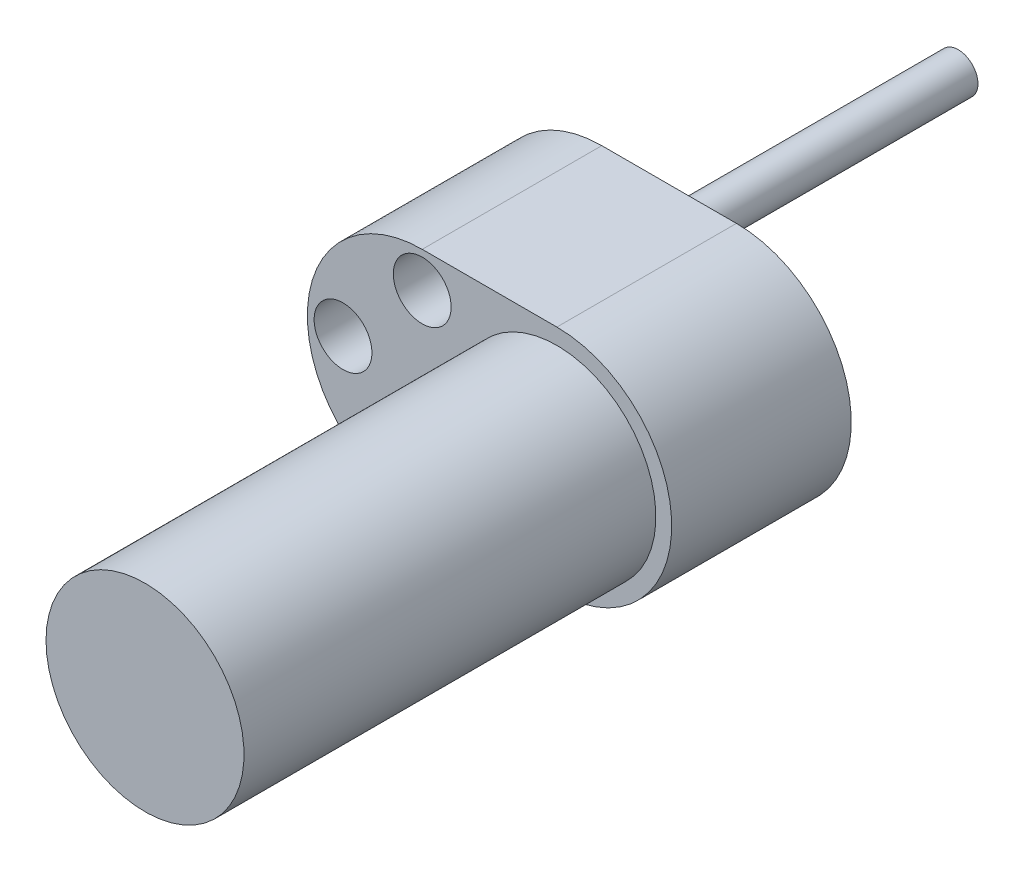
ISO-10303-21;
HEADER;
FILE_DESCRIPTION(('STEP AP214'),'2;1');
FILE_NAME('part.step','',(''),(''),'','','');
FILE_SCHEMA(('AUTOMOTIVE_DESIGN { 1 0 10303 214 1 1 1 1 }'));
ENDSEC;
DATA;
#1=APPLICATION_CONTEXT('core data for automotive mechanical design processes');
#2=APPLICATION_PROTOCOL_DEFINITION('international standard','automotive_design',2000,#1);
#3=PRODUCT_CONTEXT('',#1,'mechanical');
#4=PRODUCT('Part','Part','',(#3));
#5=PRODUCT_RELATED_PRODUCT_CATEGORY('part','',(#4));
#6=PRODUCT_DEFINITION_FORMATION('','',#4);
#7=PRODUCT_DEFINITION_CONTEXT('part definition',#1,'design');
#8=PRODUCT_DEFINITION('design','',#6,#7);
#9=PRODUCT_DEFINITION_SHAPE('','',#8);
#10=(LENGTH_UNIT() NAMED_UNIT(*) SI_UNIT(.MILLI.,.METRE.));
#11=(NAMED_UNIT(*) PLANE_ANGLE_UNIT() SI_UNIT($,.RADIAN.));
#12=(NAMED_UNIT(*) SI_UNIT($,.STERADIAN.) SOLID_ANGLE_UNIT());
#13=UNCERTAINTY_MEASURE_WITH_UNIT(LENGTH_MEASURE(1.E-05),#10,'distance_accuracy_value','');
#14=(GEOMETRIC_REPRESENTATION_CONTEXT(3) GLOBAL_UNCERTAINTY_ASSIGNED_CONTEXT((#13)) GLOBAL_UNIT_ASSIGNED_CONTEXT((#10,
#11,#12)) REPRESENTATION_CONTEXT('',''));
#15=CARTESIAN_POINT('',(0.,0.,0.));
#16=DIRECTION('',(0.,0.,1.));
#17=DIRECTION('',(1.,0.,0.));
#18=AXIS2_PLACEMENT_3D('',#15,#16,#17);
#19=CARTESIAN_POINT('',(-31.5,21.,22.67));
#20=DIRECTION('',(0.,0.,-1.));
#21=DIRECTION('',(-1.,0.,0.));
#22=AXIS2_PLACEMENT_3D('',#19,#20,#21);
#23=CYLINDRICAL_SURFACE('',#22,14.5);
#24=CARTESIAN_POINT('',(-31.5,21.,0.));
#25=DIRECTION('',(0.,0.,1.));
#26=DIRECTION('',(1.,0.,0.));
#27=AXIS2_PLACEMENT_3D('',#24,#25,#26);
#28=CIRCLE('',#27,14.5);
#29=CARTESIAN_POINT('',(-31.5,35.5,0.));
#30=VERTEX_POINT('',#29);
#31=CARTESIAN_POINT('',(-31.5,6.5,0.));
#32=VERTEX_POINT('',#31);
#33=EDGE_CURVE('E109',#30,#32,#28,.T.);
#34=ORIENTED_EDGE('',*,*,#33,.T.);
#35=DIRECTION('',(0.,0.,-1.));
#36=VECTOR('',#35,1.);
#37=CARTESIAN_POINT('',(-31.5,6.5,22.67));
#38=LINE('',#37,#36);
#39=CARTESIAN_POINT('',(-31.5,6.5,22.67));
#40=VERTEX_POINT('',#39);
#41=EDGE_CURVE('E51',#40,#32,#38,.T.);
#42=ORIENTED_EDGE('',*,*,#41,.F.);
#43=CARTESIAN_POINT('',(-31.5,21.,22.67));
#44=DIRECTION('',(0.,0.,1.));
#45=DIRECTION('',(1.,0.,0.));
#46=AXIS2_PLACEMENT_3D('',#43,#44,#45);
#47=CIRCLE('',#46,14.5);
#48=CARTESIAN_POINT('',(-31.5,35.5,22.67));
#49=VERTEX_POINT('',#48);
#50=EDGE_CURVE('E95',#49,#40,#47,.T.);
#51=ORIENTED_EDGE('',*,*,#50,.F.);
#52=DIRECTION('',(0.,0.,-1.));
#53=VECTOR('',#52,1.);
#54=CARTESIAN_POINT('',(-31.5,35.5,22.67));
#55=LINE('',#54,#53);
#56=EDGE_CURVE('E105',#49,#30,#55,.T.);
#57=ORIENTED_EDGE('',*,*,#56,.T.);
#58=EDGE_LOOP('',(#34,#42,#51,#57));
#59=FACE_BOUND('',#58,.T.);
#60=ADVANCED_FACE('F43',(#59),#23,.T.);
#61=CARTESIAN_POINT('',(-31.5,6.5,22.67));
#62=DIRECTION('',(0.,1.,0.));
#63=DIRECTION('',(0.,0.,1.));
#64=AXIS2_PLACEMENT_3D('',#61,#62,#63);
#65=PLANE('',#64);
#66=DIRECTION('',(1.,0.,0.));
#67=VECTOR('',#66,1.);
#68=CARTESIAN_POINT('',(-31.5,6.5,0.));
#69=LINE('',#68,#67);
#70=CARTESIAN_POINT('',(-14.5,6.5,0.));
#71=VERTEX_POINT('',#70);
#72=EDGE_CURVE('E100',#32,#71,#69,.T.);
#73=ORIENTED_EDGE('',*,*,#72,.T.);
#74=DIRECTION('',(0.,0.,-1.));
#75=VECTOR('',#74,1.);
#76=CARTESIAN_POINT('',(-14.5,6.5,22.67));
#77=LINE('',#76,#75);
#78=CARTESIAN_POINT('',(-14.5,6.5,22.67));
#79=VERTEX_POINT('',#78);
#80=EDGE_CURVE('E98',#79,#71,#77,.T.);
#81=ORIENTED_EDGE('',*,*,#80,.F.);
#82=DIRECTION('',(1.,0.,0.));
#83=VECTOR('',#82,1.);
#84=CARTESIAN_POINT('',(-31.5,6.5,22.67));
#85=LINE('',#84,#83);
#86=EDGE_CURVE('E90',#40,#79,#85,.T.);
#87=ORIENTED_EDGE('',*,*,#86,.F.);
#88=ORIENTED_EDGE('',*,*,#41,.T.);
#89=EDGE_LOOP('',(#73,#81,#87,#88));
#90=FACE_BOUND('',#89,.T.);
#91=ADVANCED_FACE('F99',(#90),#65,.F.);
#92=CARTESIAN_POINT('',(-14.5,21.,22.67));
#93=DIRECTION('',(0.,0.,-1.));
#94=DIRECTION('',(-1.,0.,0.));
#95=AXIS2_PLACEMENT_3D('',#92,#93,#94);
#96=CYLINDRICAL_SURFACE('',#95,14.5);
#97=CARTESIAN_POINT('',(-14.5,21.,0.));
#98=DIRECTION('',(0.,0.,1.));
#99=DIRECTION('',(1.,0.,0.));
#100=AXIS2_PLACEMENT_3D('',#97,#98,#99);
#101=CIRCLE('',#100,14.5);
#102=CARTESIAN_POINT('',(-14.5,35.5,0.));
#103=VERTEX_POINT('',#102);
#104=EDGE_CURVE('E76',#71,#103,#101,.T.);
#105=ORIENTED_EDGE('',*,*,#104,.T.);
#106=DIRECTION('',(0.,0.,-1.));
#107=VECTOR('',#106,1.);
#108=CARTESIAN_POINT('',(-14.5,35.5,22.67));
#109=LINE('',#108,#107);
#110=CARTESIAN_POINT('',(-14.5,35.5,22.67));
#111=VERTEX_POINT('',#110);
#112=EDGE_CURVE('E101',#111,#103,#109,.T.);
#113=ORIENTED_EDGE('',*,*,#112,.F.);
#114=CARTESIAN_POINT('',(-14.5,21.,22.67));
#115=DIRECTION('',(0.,0.,1.));
#116=DIRECTION('',(1.,0.,0.));
#117=AXIS2_PLACEMENT_3D('',#114,#115,#116);
#118=CIRCLE('',#117,14.5);
#119=EDGE_CURVE('E93',#79,#111,#118,.T.);
#120=ORIENTED_EDGE('',*,*,#119,.F.);
#121=ORIENTED_EDGE('',*,*,#80,.T.);
#122=EDGE_LOOP('',(#105,#113,#120,#121));
#123=FACE_BOUND('',#122,.T.);
#124=ADVANCED_FACE('F103',(#123),#96,.T.);
#125=CARTESIAN_POINT('',(-31.5,35.5,22.67));
#126=DIRECTION('',(0.,-1.,0.));
#127=DIRECTION('',(1.,0.,0.));
#128=AXIS2_PLACEMENT_3D('',#125,#126,#127);
#129=PLANE('',#128);
#130=DIRECTION('',(-1.,0.,0.));
#131=VECTOR('',#130,1.);
#132=CARTESIAN_POINT('',(-31.5,35.5,0.));
#133=LINE('',#132,#131);
#134=EDGE_CURVE('E82',#103,#30,#133,.T.);
#135=ORIENTED_EDGE('',*,*,#134,.T.);
#136=ORIENTED_EDGE('',*,*,#56,.F.);
#137=DIRECTION('',(-1.,0.,0.));
#138=VECTOR('',#137,1.);
#139=CARTESIAN_POINT('',(-31.5,35.5,22.67));
#140=LINE('',#139,#138);
#141=EDGE_CURVE('E59',#111,#49,#140,.T.);
#142=ORIENTED_EDGE('',*,*,#141,.F.);
#143=ORIENTED_EDGE('',*,*,#112,.T.);
#144=EDGE_LOOP('',(#135,#136,#142,#143));
#145=FACE_BOUND('',#144,.T.);
#146=ADVANCED_FACE('F133',(#145),#129,.F.);
#147=CARTESIAN_POINT('',(-31.5,21.,22.67));
#148=DIRECTION('',(0.,0.,1.));
#149=DIRECTION('',(1.,0.,0.));
#150=AXIS2_PLACEMENT_3D('',#147,#148,#149);
#151=PLANE('',#150);
#152=CARTESIAN_POINT('',(-14.5,21.,22.67));
#153=DIRECTION('',(0.,0.,1.));
#154=DIRECTION('',(1.,0.,0.));
#155=AXIS2_PLACEMENT_3D('',#152,#153,#154);
#156=CIRCLE('',#155,12.5);
#157=CARTESIAN_POINT('',(-27.,21.,22.67));
#158=VERTEX_POINT('',#157);
#159=EDGE_CURVE('E296',#158,#158,#156,.T.);
#160=ORIENTED_EDGE('',*,*,#159,.F.);
#161=EDGE_LOOP('',(#160));
#162=FACE_BOUND('',#161,.T.);
#163=CARTESIAN_POINT('',(-31.5,11.,22.67));
#164=DIRECTION('',(0.,0.,-1.));
#165=DIRECTION('',(-1.,0.,0.));
#166=AXIS2_PLACEMENT_3D('',#163,#164,#165);
#167=CIRCLE('',#166,3.65);
#168=CARTESIAN_POINT('',(-35.15,11.,22.67));
#169=VERTEX_POINT('',#168);
#170=EDGE_CURVE('E112',#169,#169,#167,.T.);
#171=ORIENTED_EDGE('',*,*,#170,.T.);
#172=EDGE_LOOP('',(#171));
#173=FACE_BOUND('',#172,.T.);
#174=CARTESIAN_POINT('',(-31.5,31.,22.67));
#175=DIRECTION('',(0.,0.,-1.));
#176=DIRECTION('',(-1.,0.,0.));
#177=AXIS2_PLACEMENT_3D('',#174,#175,#176);
#178=CIRCLE('',#177,3.65);
#179=CARTESIAN_POINT('',(-35.15,31.,22.67));
#180=VERTEX_POINT('',#179);
#181=EDGE_CURVE('E271',#180,#180,#178,.T.);
#182=ORIENTED_EDGE('',*,*,#181,.T.);
#183=EDGE_LOOP('',(#182));
#184=FACE_BOUND('',#183,.T.);
#185=CARTESIAN_POINT('',(-41.5,21.,22.67));
#186=DIRECTION('',(0.,0.,-1.));
#187=DIRECTION('',(-1.,0.,0.));
#188=AXIS2_PLACEMENT_3D('',#185,#186,#187);
#189=CIRCLE('',#188,3.65);
#190=CARTESIAN_POINT('',(-45.15,21.,22.67));
#191=VERTEX_POINT('',#190);
#192=EDGE_CURVE('E286',#191,#191,#189,.T.);
#193=ORIENTED_EDGE('',*,*,#192,.T.);
#194=EDGE_LOOP('',(#193));
#195=FACE_BOUND('',#194,.T.);
#196=ORIENTED_EDGE('',*,*,#50,.T.);
#197=ORIENTED_EDGE('',*,*,#86,.T.);
#198=ORIENTED_EDGE('',*,*,#119,.T.);
#199=ORIENTED_EDGE('',*,*,#141,.T.);
#200=EDGE_LOOP('',(#196,#197,#198,#199));
#201=FACE_BOUND('',#200,.T.);
#202=ADVANCED_FACE('F91',(#162,#173,#184,#195,#201),#151,.T.);
#203=CARTESIAN_POINT('',(-31.5,21.,0.));
#204=DIRECTION('',(0.,0.,1.));
#205=DIRECTION('',(1.,0.,0.));
#206=AXIS2_PLACEMENT_3D('',#203,#204,#205);
#207=PLANE('',#206);
#208=CARTESIAN_POINT('',(-31.5,21.,0.));
#209=DIRECTION('',(0.,0.,1.));
#210=DIRECTION('',(1.,0.,0.));
#211=AXIS2_PLACEMENT_3D('',#208,#209,#210);
#212=CIRCLE('',#211,2.50000000000001);
#213=CARTESIAN_POINT('',(-29.,21.,0.));
#214=VERTEX_POINT('',#213);
#215=EDGE_CURVE('E11',#214,#214,#212,.F.);
#216=ORIENTED_EDGE('',*,*,#215,.F.);
#217=EDGE_LOOP('',(#216));
#218=FACE_BOUND('',#217,.T.);
#219=CARTESIAN_POINT('',(-31.5,11.,0.));
#220=DIRECTION('',(0.,0.,-1.));
#221=DIRECTION('',(-1.,0.,0.));
#222=AXIS2_PLACEMENT_3D('',#219,#220,#221);
#223=CIRCLE('',#222,3.65);
#224=CARTESIAN_POINT('',(-35.15,11.,0.));
#225=VERTEX_POINT('',#224);
#226=EDGE_CURVE('E276',#225,#225,#223,.T.);
#227=ORIENTED_EDGE('',*,*,#226,.F.);
#228=EDGE_LOOP('',(#227));
#229=FACE_BOUND('',#228,.T.);
#230=CARTESIAN_POINT('',(-31.5,31.,0.));
#231=DIRECTION('',(0.,0.,-1.));
#232=DIRECTION('',(-1.,0.,0.));
#233=AXIS2_PLACEMENT_3D('',#230,#231,#232);
#234=CIRCLE('',#233,3.65);
#235=CARTESIAN_POINT('',(-35.15,31.,0.));
#236=VERTEX_POINT('',#235);
#237=EDGE_CURVE('E274',#236,#236,#234,.T.);
#238=ORIENTED_EDGE('',*,*,#237,.F.);
#239=EDGE_LOOP('',(#238));
#240=FACE_BOUND('',#239,.T.);
#241=CARTESIAN_POINT('',(-41.5,21.,0.));
#242=DIRECTION('',(0.,0.,-1.));
#243=DIRECTION('',(-1.,0.,0.));
#244=AXIS2_PLACEMENT_3D('',#241,#242,#243);
#245=CIRCLE('',#244,3.65);
#246=CARTESIAN_POINT('',(-45.15,21.,0.));
#247=VERTEX_POINT('',#246);
#248=EDGE_CURVE('E280',#247,#247,#245,.T.);
#249=ORIENTED_EDGE('',*,*,#248,.F.);
#250=EDGE_LOOP('',(#249));
#251=FACE_BOUND('',#250,.T.);
#252=ORIENTED_EDGE('',*,*,#33,.F.);
#253=ORIENTED_EDGE('',*,*,#134,.F.);
#254=ORIENTED_EDGE('',*,*,#104,.F.);
#255=ORIENTED_EDGE('',*,*,#72,.F.);
#256=EDGE_LOOP('',(#252,#253,#254,#255));
#257=FACE_BOUND('',#256,.T.);
#258=ADVANCED_FACE('F120',(#218,#229,#240,#251,#257),#207,.F.);
#259=CARTESIAN_POINT('',(-41.5,21.,22.67));
#260=DIRECTION('',(0.,0.,-1.));
#261=DIRECTION('',(-1.,0.,0.));
#262=AXIS2_PLACEMENT_3D('',#259,#260,#261);
#263=CYLINDRICAL_SURFACE('',#262,3.65);
#264=CARTESIAN_POINT('',(-45.15,21.,22.67));
#265=CARTESIAN_POINT('',(-45.15,21.,22.4338541666667));
#266=CARTESIAN_POINT('',(-45.15,21.,22.1977083333333));
#267=CARTESIAN_POINT('',(-45.15,21.,21.7254166666667));
#268=CARTESIAN_POINT('',(-45.15,21.,21.4892708333333));
#269=CARTESIAN_POINT('',(-45.15,21.,21.0169791666667));
#270=CARTESIAN_POINT('',(-45.15,21.,20.7808333333333));
#271=CARTESIAN_POINT('',(-45.15,21.,20.3085416666667));
#272=CARTESIAN_POINT('',(-45.15,21.,20.0723958333333));
#273=CARTESIAN_POINT('',(-45.15,21.,19.6001041666667));
#274=CARTESIAN_POINT('',(-45.15,21.,19.3639583333333));
#275=CARTESIAN_POINT('',(-45.15,21.,18.8916666666667));
#276=CARTESIAN_POINT('',(-45.15,21.,18.6555208333333));
#277=CARTESIAN_POINT('',(-45.15,21.,18.1832291666667));
#278=CARTESIAN_POINT('',(-45.15,21.,17.9470833333333));
#279=CARTESIAN_POINT('',(-45.15,21.,17.4747916666667));
#280=CARTESIAN_POINT('',(-45.15,21.,17.2386458333333));
#281=CARTESIAN_POINT('',(-45.15,21.,16.7663541666667));
#282=CARTESIAN_POINT('',(-45.15,21.,16.5302083333333));
#283=CARTESIAN_POINT('',(-45.15,21.,16.0579166666667));
#284=CARTESIAN_POINT('',(-45.15,21.,15.8217708333333));
#285=CARTESIAN_POINT('',(-45.15,21.,15.3494791666667));
#286=CARTESIAN_POINT('',(-45.15,21.,15.1133333333333));
#287=CARTESIAN_POINT('',(-45.15,21.,14.6410416666667));
#288=CARTESIAN_POINT('',(-45.15,21.,14.4048958333333));
#289=CARTESIAN_POINT('',(-45.15,21.,13.9326041666667));
#290=CARTESIAN_POINT('',(-45.15,21.,13.6964583333333));
#291=CARTESIAN_POINT('',(-45.15,21.,13.2241666666667));
#292=CARTESIAN_POINT('',(-45.15,21.,12.9880208333333));
#293=CARTESIAN_POINT('',(-45.15,21.,12.5157291666667));
#294=CARTESIAN_POINT('',(-45.15,21.,12.2795833333333));
#295=CARTESIAN_POINT('',(-45.15,21.,11.8072916666667));
#296=CARTESIAN_POINT('',(-45.15,21.,11.5711458333333));
#297=CARTESIAN_POINT('',(-45.15,21.,11.0988541666667));
#298=CARTESIAN_POINT('',(-45.15,21.,10.8627083333333));
#299=CARTESIAN_POINT('',(-45.15,21.,10.3904166666667));
#300=CARTESIAN_POINT('',(-45.15,21.,10.1542708333333));
#301=CARTESIAN_POINT('',(-45.15,21.,9.68197916666667));
#302=CARTESIAN_POINT('',(-45.15,21.,9.44583333333334));
#303=CARTESIAN_POINT('',(-45.15,21.,8.97354166666667));
#304=CARTESIAN_POINT('',(-45.15,21.,8.73739583333334));
#305=CARTESIAN_POINT('',(-45.15,21.,8.26510416666667));
#306=CARTESIAN_POINT('',(-45.15,21.,8.02895833333334));
#307=CARTESIAN_POINT('',(-45.15,21.,7.55666666666667));
#308=CARTESIAN_POINT('',(-45.15,21.,7.32052083333334));
#309=CARTESIAN_POINT('',(-45.15,21.,6.84822916666667));
#310=CARTESIAN_POINT('',(-45.15,21.,6.61208333333334));
#311=CARTESIAN_POINT('',(-45.15,21.,6.13979166666667));
#312=CARTESIAN_POINT('',(-45.15,21.,5.90364583333334));
#313=CARTESIAN_POINT('',(-45.15,21.,5.43135416666667));
#314=CARTESIAN_POINT('',(-45.15,21.,5.19520833333334));
#315=CARTESIAN_POINT('',(-45.15,21.,4.72291666666667));
#316=CARTESIAN_POINT('',(-45.15,21.,4.48677083333334));
#317=CARTESIAN_POINT('',(-45.15,21.,4.01447916666667));
#318=CARTESIAN_POINT('',(-45.15,21.,3.77833333333334));
#319=CARTESIAN_POINT('',(-45.15,21.,3.30604166666667));
#320=CARTESIAN_POINT('',(-45.15,21.,3.06989583333334));
#321=CARTESIAN_POINT('',(-45.15,21.,2.59760416666667));
#322=CARTESIAN_POINT('',(-45.15,21.,2.36145833333334));
#323=CARTESIAN_POINT('',(-45.15,21.,1.88916666666667));
#324=CARTESIAN_POINT('',(-45.15,21.,1.65302083333334));
#325=CARTESIAN_POINT('',(-45.15,21.,1.18072916666667));
#326=CARTESIAN_POINT('',(-45.15,21.,0.944583333333337));
#327=CARTESIAN_POINT('',(-45.15,21.,0.472291666666669));
#328=CARTESIAN_POINT('',(-45.15,21.,0.236145833333337));
#329=CARTESIAN_POINT('',(-45.15,21.,0.));
#330=B_SPLINE_CURVE_WITH_KNOTS('',3,(#264,#265,#266,#267,#268,#269,#270,#271,#272,#273,#274,
#275,#276,#277,#278,#279,#280,#281,#282,#283,#284,#285,#286,#287,#288,#289,#290,#291,#292,#293,
#294,#295,#296,#297,#298,#299,#300,#301,#302,#303,#304,#305,#306,#307,#308,#309,#310,#311,#312,
#313,#314,#315,#316,#317,#318,#319,#320,#321,#322,#323,#324,#325,#326,#327,#328,#329),
.UNSPECIFIED.,.F.,.F.,(4,2,2,2,2,2,2,2,2,2,2,2,2,2,2,2,2,2,2,2,2,2,2,2,2,2,2,2,2,2,2,2,4),(0.,
0.708437499999999,1.416875,2.1253125,2.83375,3.5421875,4.250625,4.9590625,5.6675,6.3759375,
7.084375,7.7928125,8.50125,9.2096875,9.918125,10.6265625,11.335,12.0434375,12.751875,13.4603125,
14.16875,14.8771875,15.585625,16.2940625,17.0025,17.7109375,18.419375,19.1278125,19.83625,
20.5446875,21.253125,21.9615625,22.67),.UNSPECIFIED.);
#331=EDGE_CURVE('BSEAM122',#191,#247,#330,.T.);
#332=ORIENTED_EDGE('',*,*,#192,.F.);
#333=ORIENTED_EDGE('',*,*,#248,.T.);
#334=ORIENTED_EDGE('',*,*,#331,.T.);
#335=ORIENTED_EDGE('',*,*,#331,.F.);
#336=EDGE_LOOP('',(#332,#334,#333,#335));
#337=FACE_BOUND('',#336,.T.);
#338=ADVANCED_FACE('F122',(#337),#263,.F.);
#339=CARTESIAN_POINT('',(-31.5,31.,22.67));
#340=DIRECTION('',(0.,0.,-1.));
#341=DIRECTION('',(-1.,0.,0.));
#342=AXIS2_PLACEMENT_3D('',#339,#340,#341);
#343=CYLINDRICAL_SURFACE('',#342,3.65);
#344=CARTESIAN_POINT('',(-35.15,31.,22.67));
#345=CARTESIAN_POINT('',(-35.15,31.,22.4338541666667));
#346=CARTESIAN_POINT('',(-35.15,31.,22.1977083333333));
#347=CARTESIAN_POINT('',(-35.15,31.,21.7254166666667));
#348=CARTESIAN_POINT('',(-35.15,31.,21.4892708333333));
#349=CARTESIAN_POINT('',(-35.15,31.,21.0169791666667));
#350=CARTESIAN_POINT('',(-35.15,31.,20.7808333333333));
#351=CARTESIAN_POINT('',(-35.15,31.,20.3085416666667));
#352=CARTESIAN_POINT('',(-35.15,31.,20.0723958333333));
#353=CARTESIAN_POINT('',(-35.15,31.,19.6001041666667));
#354=CARTESIAN_POINT('',(-35.15,31.,19.3639583333333));
#355=CARTESIAN_POINT('',(-35.15,31.,18.8916666666667));
#356=CARTESIAN_POINT('',(-35.15,31.,18.6555208333333));
#357=CARTESIAN_POINT('',(-35.15,31.,18.1832291666667));
#358=CARTESIAN_POINT('',(-35.15,31.,17.9470833333333));
#359=CARTESIAN_POINT('',(-35.15,31.,17.4747916666667));
#360=CARTESIAN_POINT('',(-35.15,31.,17.2386458333333));
#361=CARTESIAN_POINT('',(-35.15,31.,16.7663541666667));
#362=CARTESIAN_POINT('',(-35.15,31.,16.5302083333333));
#363=CARTESIAN_POINT('',(-35.15,31.,16.0579166666667));
#364=CARTESIAN_POINT('',(-35.15,31.,15.8217708333333));
#365=CARTESIAN_POINT('',(-35.15,31.,15.3494791666667));
#366=CARTESIAN_POINT('',(-35.15,31.,15.1133333333333));
#367=CARTESIAN_POINT('',(-35.15,31.,14.6410416666667));
#368=CARTESIAN_POINT('',(-35.15,31.,14.4048958333333));
#369=CARTESIAN_POINT('',(-35.15,31.,13.9326041666667));
#370=CARTESIAN_POINT('',(-35.15,31.,13.6964583333333));
#371=CARTESIAN_POINT('',(-35.15,31.,13.2241666666667));
#372=CARTESIAN_POINT('',(-35.15,31.,12.9880208333333));
#373=CARTESIAN_POINT('',(-35.15,31.,12.5157291666667));
#374=CARTESIAN_POINT('',(-35.15,31.,12.2795833333333));
#375=CARTESIAN_POINT('',(-35.15,31.,11.8072916666667));
#376=CARTESIAN_POINT('',(-35.15,31.,11.5711458333333));
#377=CARTESIAN_POINT('',(-35.15,31.,11.0988541666667));
#378=CARTESIAN_POINT('',(-35.15,31.,10.8627083333333));
#379=CARTESIAN_POINT('',(-35.15,31.,10.3904166666667));
#380=CARTESIAN_POINT('',(-35.15,31.,10.1542708333333));
#381=CARTESIAN_POINT('',(-35.15,31.,9.68197916666667));
#382=CARTESIAN_POINT('',(-35.15,31.,9.44583333333334));
#383=CARTESIAN_POINT('',(-35.15,31.,8.97354166666667));
#384=CARTESIAN_POINT('',(-35.15,31.,8.73739583333334));
#385=CARTESIAN_POINT('',(-35.15,31.,8.26510416666667));
#386=CARTESIAN_POINT('',(-35.15,31.,8.02895833333334));
#387=CARTESIAN_POINT('',(-35.15,31.,7.55666666666667));
#388=CARTESIAN_POINT('',(-35.15,31.,7.32052083333334));
#389=CARTESIAN_POINT('',(-35.15,31.,6.84822916666667));
#390=CARTESIAN_POINT('',(-35.15,31.,6.61208333333334));
#391=CARTESIAN_POINT('',(-35.15,31.,6.13979166666667));
#392=CARTESIAN_POINT('',(-35.15,31.,5.90364583333334));
#393=CARTESIAN_POINT('',(-35.15,31.,5.43135416666667));
#394=CARTESIAN_POINT('',(-35.15,31.,5.19520833333334));
#395=CARTESIAN_POINT('',(-35.15,31.,4.72291666666667));
#396=CARTESIAN_POINT('',(-35.15,31.,4.48677083333334));
#397=CARTESIAN_POINT('',(-35.15,31.,4.01447916666667));
#398=CARTESIAN_POINT('',(-35.15,31.,3.77833333333334));
#399=CARTESIAN_POINT('',(-35.15,31.,3.30604166666667));
#400=CARTESIAN_POINT('',(-35.15,31.,3.06989583333334));
#401=CARTESIAN_POINT('',(-35.15,31.,2.59760416666667));
#402=CARTESIAN_POINT('',(-35.15,31.,2.36145833333334));
#403=CARTESIAN_POINT('',(-35.15,31.,1.88916666666667));
#404=CARTESIAN_POINT('',(-35.15,31.,1.65302083333334));
#405=CARTESIAN_POINT('',(-35.15,31.,1.18072916666667));
#406=CARTESIAN_POINT('',(-35.15,31.,0.944583333333337));
#407=CARTESIAN_POINT('',(-35.15,31.,0.472291666666669));
#408=CARTESIAN_POINT('',(-35.15,31.,0.236145833333337));
#409=CARTESIAN_POINT('',(-35.15,31.,0.));
#410=B_SPLINE_CURVE_WITH_KNOTS('',3,(#344,#345,#346,#347,#348,#349,#350,#351,#352,#353,#354,
#355,#356,#357,#358,#359,#360,#361,#362,#363,#364,#365,#366,#367,#368,#369,#370,#371,#372,#373,
#374,#375,#376,#377,#378,#379,#380,#381,#382,#383,#384,#385,#386,#387,#388,#389,#390,#391,#392,
#393,#394,#395,#396,#397,#398,#399,#400,#401,#402,#403,#404,#405,#406,#407,#408,#409),
.UNSPECIFIED.,.F.,.F.,(4,2,2,2,2,2,2,2,2,2,2,2,2,2,2,2,2,2,2,2,2,2,2,2,2,2,2,2,2,2,2,2,4),(0.,
0.708437499999999,1.416875,2.1253125,2.83375,3.5421875,4.250625,4.9590625,5.6675,6.3759375,
7.084375,7.7928125,8.50125,9.2096875,9.918125,10.6265625,11.335,12.0434375,12.751875,13.4603125,
14.16875,14.8771875,15.585625,16.2940625,17.0025,17.7109375,18.419375,19.1278125,19.83625,
20.5446875,21.253125,21.9615625,22.67),.UNSPECIFIED.);
#411=EDGE_CURVE('BSEAM129',#180,#236,#410,.T.);
#412=ORIENTED_EDGE('',*,*,#181,.F.);
#413=ORIENTED_EDGE('',*,*,#237,.T.);
#414=ORIENTED_EDGE('',*,*,#411,.T.);
#415=ORIENTED_EDGE('',*,*,#411,.F.);
#416=EDGE_LOOP('',(#412,#414,#413,#415));
#417=FACE_BOUND('',#416,.T.);
#418=ADVANCED_FACE('F129',(#417),#343,.F.);
#419=CARTESIAN_POINT('',(-31.5,11.,22.67));
#420=DIRECTION('',(0.,0.,-1.));
#421=DIRECTION('',(-1.,0.,0.));
#422=AXIS2_PLACEMENT_3D('',#419,#420,#421);
#423=CYLINDRICAL_SURFACE('',#422,3.65);
#424=CARTESIAN_POINT('',(-35.15,11.,22.67));
#425=CARTESIAN_POINT('',(-35.15,11.,22.4338541666667));
#426=CARTESIAN_POINT('',(-35.15,11.,22.1977083333333));
#427=CARTESIAN_POINT('',(-35.15,11.,21.7254166666667));
#428=CARTESIAN_POINT('',(-35.15,11.,21.4892708333333));
#429=CARTESIAN_POINT('',(-35.15,11.,21.0169791666667));
#430=CARTESIAN_POINT('',(-35.15,11.,20.7808333333333));
#431=CARTESIAN_POINT('',(-35.15,11.,20.3085416666667));
#432=CARTESIAN_POINT('',(-35.15,11.,20.0723958333333));
#433=CARTESIAN_POINT('',(-35.15,11.,19.6001041666667));
#434=CARTESIAN_POINT('',(-35.15,11.,19.3639583333333));
#435=CARTESIAN_POINT('',(-35.15,11.,18.8916666666667));
#436=CARTESIAN_POINT('',(-35.15,11.,18.6555208333333));
#437=CARTESIAN_POINT('',(-35.15,11.,18.1832291666667));
#438=CARTESIAN_POINT('',(-35.15,11.,17.9470833333333));
#439=CARTESIAN_POINT('',(-35.15,11.,17.4747916666667));
#440=CARTESIAN_POINT('',(-35.15,11.,17.2386458333333));
#441=CARTESIAN_POINT('',(-35.15,11.,16.7663541666667));
#442=CARTESIAN_POINT('',(-35.15,11.,16.5302083333333));
#443=CARTESIAN_POINT('',(-35.15,11.,16.0579166666667));
#444=CARTESIAN_POINT('',(-35.15,11.,15.8217708333333));
#445=CARTESIAN_POINT('',(-35.15,11.,15.3494791666667));
#446=CARTESIAN_POINT('',(-35.15,11.,15.1133333333333));
#447=CARTESIAN_POINT('',(-35.15,11.,14.6410416666667));
#448=CARTESIAN_POINT('',(-35.15,11.,14.4048958333333));
#449=CARTESIAN_POINT('',(-35.15,11.,13.9326041666667));
#450=CARTESIAN_POINT('',(-35.15,11.,13.6964583333333));
#451=CARTESIAN_POINT('',(-35.15,11.,13.2241666666667));
#452=CARTESIAN_POINT('',(-35.15,11.,12.9880208333333));
#453=CARTESIAN_POINT('',(-35.15,11.,12.5157291666667));
#454=CARTESIAN_POINT('',(-35.15,11.,12.2795833333333));
#455=CARTESIAN_POINT('',(-35.15,11.,11.8072916666667));
#456=CARTESIAN_POINT('',(-35.15,11.,11.5711458333333));
#457=CARTESIAN_POINT('',(-35.15,11.,11.0988541666667));
#458=CARTESIAN_POINT('',(-35.15,11.,10.8627083333333));
#459=CARTESIAN_POINT('',(-35.15,11.,10.3904166666667));
#460=CARTESIAN_POINT('',(-35.15,11.,10.1542708333333));
#461=CARTESIAN_POINT('',(-35.15,11.,9.68197916666667));
#462=CARTESIAN_POINT('',(-35.15,11.,9.44583333333334));
#463=CARTESIAN_POINT('',(-35.15,11.,8.97354166666667));
#464=CARTESIAN_POINT('',(-35.15,11.,8.73739583333334));
#465=CARTESIAN_POINT('',(-35.15,11.,8.26510416666667));
#466=CARTESIAN_POINT('',(-35.15,11.,8.02895833333334));
#467=CARTESIAN_POINT('',(-35.15,11.,7.55666666666667));
#468=CARTESIAN_POINT('',(-35.15,11.,7.32052083333334));
#469=CARTESIAN_POINT('',(-35.15,11.,6.84822916666667));
#470=CARTESIAN_POINT('',(-35.15,11.,6.61208333333334));
#471=CARTESIAN_POINT('',(-35.15,11.,6.13979166666667));
#472=CARTESIAN_POINT('',(-35.15,11.,5.90364583333334));
#473=CARTESIAN_POINT('',(-35.15,11.,5.43135416666667));
#474=CARTESIAN_POINT('',(-35.15,11.,5.19520833333334));
#475=CARTESIAN_POINT('',(-35.15,11.,4.72291666666667));
#476=CARTESIAN_POINT('',(-35.15,11.,4.48677083333334));
#477=CARTESIAN_POINT('',(-35.15,11.,4.01447916666667));
#478=CARTESIAN_POINT('',(-35.15,11.,3.77833333333334));
#479=CARTESIAN_POINT('',(-35.15,11.,3.30604166666667));
#480=CARTESIAN_POINT('',(-35.15,11.,3.06989583333334));
#481=CARTESIAN_POINT('',(-35.15,11.,2.59760416666667));
#482=CARTESIAN_POINT('',(-35.15,11.,2.36145833333334));
#483=CARTESIAN_POINT('',(-35.15,11.,1.88916666666667));
#484=CARTESIAN_POINT('',(-35.15,11.,1.65302083333334));
#485=CARTESIAN_POINT('',(-35.15,11.,1.18072916666667));
#486=CARTESIAN_POINT('',(-35.15,11.,0.944583333333337));
#487=CARTESIAN_POINT('',(-35.15,11.,0.472291666666669));
#488=CARTESIAN_POINT('',(-35.15,11.,0.236145833333337));
#489=CARTESIAN_POINT('',(-35.15,11.,0.));
#490=B_SPLINE_CURVE_WITH_KNOTS('',3,(#424,#425,#426,#427,#428,#429,#430,#431,#432,#433,#434,
#435,#436,#437,#438,#439,#440,#441,#442,#443,#444,#445,#446,#447,#448,#449,#450,#451,#452,#453,
#454,#455,#456,#457,#458,#459,#460,#461,#462,#463,#464,#465,#466,#467,#468,#469,#470,#471,#472,
#473,#474,#475,#476,#477,#478,#479,#480,#481,#482,#483,#484,#485,#486,#487,#488,#489),
.UNSPECIFIED.,.F.,.F.,(4,2,2,2,2,2,2,2,2,2,2,2,2,2,2,2,2,2,2,2,2,2,2,2,2,2,2,2,2,2,2,2,4),(0.,
0.708437499999999,1.416875,2.1253125,2.83375,3.5421875,4.250625,4.9590625,5.6675,6.3759375,
7.084375,7.7928125,8.50125,9.2096875,9.918125,10.6265625,11.335,12.0434375,12.751875,13.4603125,
14.16875,14.8771875,15.585625,16.2940625,17.0025,17.7109375,18.419375,19.1278125,19.83625,
20.5446875,21.253125,21.9615625,22.67),.UNSPECIFIED.);
#491=EDGE_CURVE('BSEAM204',#169,#225,#490,.T.);
#492=ORIENTED_EDGE('',*,*,#170,.F.);
#493=ORIENTED_EDGE('',*,*,#226,.T.);
#494=ORIENTED_EDGE('',*,*,#491,.T.);
#495=ORIENTED_EDGE('',*,*,#491,.F.);
#496=EDGE_LOOP('',(#492,#494,#493,#495));
#497=FACE_BOUND('',#496,.T.);
#498=ADVANCED_FACE('F204',(#497),#423,.F.);
#499=CARTESIAN_POINT('',(-31.5,21.,-45.));
#500=DIRECTION('',(0.,0.,1.));
#501=DIRECTION('',(1.,0.,0.));
#502=AXIS2_PLACEMENT_3D('',#499,#500,#501);
#503=CYLINDRICAL_SURFACE('',#502,2.50000000000001);
#504=CARTESIAN_POINT('',(-31.5,21.,-45.));
#505=DIRECTION('',(0.,0.,-1.));
#506=DIRECTION('',(-1.,0.,0.));
#507=AXIS2_PLACEMENT_3D('',#504,#505,#506);
#508=CIRCLE('',#507,2.50000000000001);
#509=CARTESIAN_POINT('',(-29.,21.,-45.));
#510=VERTEX_POINT('',#509);
#511=EDGE_CURVE('E288',#510,#510,#508,.T.);
#512=CARTESIAN_POINT('',(-29.,21.,-45.));
#513=CARTESIAN_POINT('',(-29.,21.,-44.53125));
#514=CARTESIAN_POINT('',(-29.,21.,-44.0625));
#515=CARTESIAN_POINT('',(-29.,21.,-43.125));
#516=CARTESIAN_POINT('',(-29.,21.,-42.65625));
#517=CARTESIAN_POINT('',(-29.,21.,-41.71875));
#518=CARTESIAN_POINT('',(-29.,21.,-41.25));
#519=CARTESIAN_POINT('',(-29.,21.,-40.3125));
#520=CARTESIAN_POINT('',(-29.,21.,-39.84375));
#521=CARTESIAN_POINT('',(-29.,21.,-38.90625));
#522=CARTESIAN_POINT('',(-29.,21.,-38.4375));
#523=CARTESIAN_POINT('',(-29.,21.,-37.5));
#524=CARTESIAN_POINT('',(-29.,21.,-37.03125));
#525=CARTESIAN_POINT('',(-29.,21.,-36.09375));
#526=CARTESIAN_POINT('',(-29.,21.,-35.625));
#527=CARTESIAN_POINT('',(-29.,21.,-34.6875));
#528=CARTESIAN_POINT('',(-29.,21.,-34.21875));
#529=CARTESIAN_POINT('',(-29.,21.,-33.28125));
#530=CARTESIAN_POINT('',(-29.,21.,-32.8125));
#531=CARTESIAN_POINT('',(-29.,21.,-31.875));
#532=CARTESIAN_POINT('',(-29.,21.,-31.40625));
#533=CARTESIAN_POINT('',(-29.,21.,-30.46875));
#534=CARTESIAN_POINT('',(-29.,21.,-30.));
#535=CARTESIAN_POINT('',(-29.,21.,-29.0625));
#536=CARTESIAN_POINT('',(-29.,21.,-28.59375));
#537=CARTESIAN_POINT('',(-29.,21.,-27.65625));
#538=CARTESIAN_POINT('',(-29.,21.,-27.1875));
#539=CARTESIAN_POINT('',(-29.,21.,-26.25));
#540=CARTESIAN_POINT('',(-29.,21.,-25.78125));
#541=CARTESIAN_POINT('',(-29.,21.,-24.84375));
#542=CARTESIAN_POINT('',(-29.,21.,-24.375));
#543=CARTESIAN_POINT('',(-29.,21.,-23.4375));
#544=CARTESIAN_POINT('',(-29.,21.,-22.96875));
#545=CARTESIAN_POINT('',(-29.,21.,-22.03125));
#546=CARTESIAN_POINT('',(-29.,21.,-21.5625));
#547=CARTESIAN_POINT('',(-29.,21.,-20.625));
#548=CARTESIAN_POINT('',(-29.,21.,-20.15625));
#549=CARTESIAN_POINT('',(-29.,21.,-19.21875));
#550=CARTESIAN_POINT('',(-29.,21.,-18.75));
#551=CARTESIAN_POINT('',(-29.,21.,-17.8125));
#552=CARTESIAN_POINT('',(-29.,21.,-17.34375));
#553=CARTESIAN_POINT('',(-29.,21.,-16.40625));
#554=CARTESIAN_POINT('',(-29.,21.,-15.9375));
#555=CARTESIAN_POINT('',(-29.,21.,-15.));
#556=CARTESIAN_POINT('',(-29.,21.,-14.53125));
#557=CARTESIAN_POINT('',(-29.,21.,-13.59375));
#558=CARTESIAN_POINT('',(-29.,21.,-13.125));
#559=CARTESIAN_POINT('',(-29.,21.,-12.1875));
#560=CARTESIAN_POINT('',(-29.,21.,-11.71875));
#561=CARTESIAN_POINT('',(-29.,21.,-10.78125));
#562=CARTESIAN_POINT('',(-29.,21.,-10.3125));
#563=CARTESIAN_POINT('',(-29.,21.,-9.37500000000001));
#564=CARTESIAN_POINT('',(-29.,21.,-8.90625000000001));
#565=CARTESIAN_POINT('',(-29.,21.,-7.96875000000001));
#566=CARTESIAN_POINT('',(-29.,21.,-7.5));
#567=CARTESIAN_POINT('',(-29.,21.,-6.5625));
#568=CARTESIAN_POINT('',(-29.,21.,-6.09375));
#569=CARTESIAN_POINT('',(-29.,21.,-5.15625000000001));
#570=CARTESIAN_POINT('',(-29.,21.,-4.68750000000001));
#571=CARTESIAN_POINT('',(-29.,21.,-3.75000000000001));
#572=CARTESIAN_POINT('',(-29.,21.,-3.28125000000001));
#573=CARTESIAN_POINT('',(-29.,21.,-2.34375000000001));
#574=CARTESIAN_POINT('',(-29.,21.,-1.87500000000001));
#575=CARTESIAN_POINT('',(-29.,21.,-0.937500000000006));
#576=CARTESIAN_POINT('',(-29.,21.,-0.468750000000007));
#577=CARTESIAN_POINT('',(-29.,21.,0.));
#578=B_SPLINE_CURVE_WITH_KNOTS('',3,(#512,#513,#514,#515,#516,#517,#518,#519,#520,#521,#522,
#523,#524,#525,#526,#527,#528,#529,#530,#531,#532,#533,#534,#535,#536,#537,#538,#539,#540,#541,
#542,#543,#544,#545,#546,#547,#548,#549,#550,#551,#552,#553,#554,#555,#556,#557,#558,#559,#560,
#561,#562,#563,#564,#565,#566,#567,#568,#569,#570,#571,#572,#573,#574,#575,#576,#577),
.UNSPECIFIED.,.F.,.F.,(4,2,2,2,2,2,2,2,2,2,2,2,2,2,2,2,2,2,2,2,2,2,2,2,2,2,2,2,2,2,2,2,4),(0.,
1.40625,2.8125,4.21874999999999,5.625,7.03125,8.43749999999999,9.84374999999999,11.25,12.65625,
14.0625,15.46875,16.875,18.28125,19.6875,21.09375,22.5,23.90625,25.3125,26.71875,28.125,
29.53125,30.9375,32.34375,33.75,35.15625,36.5625,37.96875,39.375,40.78125,42.1875,43.59375,45.),.UNSPECIFIED.);
#579=EDGE_CURVE('BSEAM195',#510,#214,#578,.T.);
#580=ORIENTED_EDGE('',*,*,#511,.F.);
#581=ORIENTED_EDGE('',*,*,#215,.T.);
#582=ORIENTED_EDGE('',*,*,#579,.T.);
#583=ORIENTED_EDGE('',*,*,#579,.F.);
#584=EDGE_LOOP('',(#580,#582,#581,#583));
#585=FACE_BOUND('',#584,.T.);
#586=ADVANCED_FACE('F195',(#585),#503,.T.);
#587=CARTESIAN_POINT('',(-31.5,21.,-45.));
#588=DIRECTION('',(0.,0.,-1.));
#589=DIRECTION('',(-1.,0.,0.));
#590=AXIS2_PLACEMENT_3D('',#587,#588,#589);
#591=PLANE('',#590);
#592=ORIENTED_EDGE('',*,*,#511,.T.);
#593=EDGE_LOOP('',(#592));
#594=FACE_BOUND('',#593,.T.);
#595=ADVANCED_FACE('F164',(#594),#591,.T.);
#596=CARTESIAN_POINT('',(-14.5,21.,74.67));
#597=DIRECTION('',(0.,0.,-1.));
#598=DIRECTION('',(-1.,0.,0.));
#599=AXIS2_PLACEMENT_3D('',#596,#597,#598);
#600=CYLINDRICAL_SURFACE('',#599,12.5);
#601=CARTESIAN_POINT('',(-14.5,21.,74.67));
#602=DIRECTION('',(0.,0.,1.));
#603=DIRECTION('',(1.,0.,0.));
#604=AXIS2_PLACEMENT_3D('',#601,#602,#603);
#605=CIRCLE('',#604,12.5);
#606=CARTESIAN_POINT('',(-27.,21.,74.67));
#607=VERTEX_POINT('',#606);
#608=EDGE_CURVE('E292',#607,#607,#605,.T.);
#609=CARTESIAN_POINT('',(-27.,21.,74.67));
#610=CARTESIAN_POINT('',(-27.,21.,74.1283333333333));
#611=CARTESIAN_POINT('',(-27.,21.,73.5866666666667));
#612=CARTESIAN_POINT('',(-27.,21.,72.5033333333333));
#613=CARTESIAN_POINT('',(-27.,21.,71.9616666666667));
#614=CARTESIAN_POINT('',(-27.,21.,70.8783333333333));
#615=CARTESIAN_POINT('',(-27.,21.,70.3366666666667));
#616=CARTESIAN_POINT('',(-27.,21.,69.2533333333333));
#617=CARTESIAN_POINT('',(-27.,21.,68.7116666666667));
#618=CARTESIAN_POINT('',(-27.,21.,67.6283333333333));
#619=CARTESIAN_POINT('',(-27.,21.,67.0866666666667));
#620=CARTESIAN_POINT('',(-27.,21.,66.0033333333333));
#621=CARTESIAN_POINT('',(-27.,21.,65.4616666666667));
#622=CARTESIAN_POINT('',(-27.,21.,64.3783333333333));
#623=CARTESIAN_POINT('',(-27.,21.,63.8366666666667));
#624=CARTESIAN_POINT('',(-27.,21.,62.7533333333333));
#625=CARTESIAN_POINT('',(-27.,21.,62.2116666666667));
#626=CARTESIAN_POINT('',(-27.,21.,61.1283333333333));
#627=CARTESIAN_POINT('',(-27.,21.,60.5866666666667));
#628=CARTESIAN_POINT('',(-27.,21.,59.5033333333333));
#629=CARTESIAN_POINT('',(-27.,21.,58.9616666666667));
#630=CARTESIAN_POINT('',(-27.,21.,57.8783333333333));
#631=CARTESIAN_POINT('',(-27.,21.,57.3366666666667));
#632=CARTESIAN_POINT('',(-27.,21.,56.2533333333333));
#633=CARTESIAN_POINT('',(-27.,21.,55.7116666666667));
#634=CARTESIAN_POINT('',(-27.,21.,54.6283333333333));
#635=CARTESIAN_POINT('',(-27.,21.,54.0866666666667));
#636=CARTESIAN_POINT('',(-27.,21.,53.0033333333333));
#637=CARTESIAN_POINT('',(-27.,21.,52.4616666666667));
#638=CARTESIAN_POINT('',(-27.,21.,51.3783333333333));
#639=CARTESIAN_POINT('',(-27.,21.,50.8366666666667));
#640=CARTESIAN_POINT('',(-27.,21.,49.7533333333333));
#641=CARTESIAN_POINT('',(-27.,21.,49.2116666666667));
#642=CARTESIAN_POINT('',(-27.,21.,48.1283333333333));
#643=CARTESIAN_POINT('',(-27.,21.,47.5866666666667));
#644=CARTESIAN_POINT('',(-27.,21.,46.5033333333333));
#645=CARTESIAN_POINT('',(-27.,21.,45.9616666666667));
#646=CARTESIAN_POINT('',(-27.,21.,44.8783333333333));
#647=CARTESIAN_POINT('',(-27.,21.,44.3366666666667));
#648=CARTESIAN_POINT('',(-27.,21.,43.2533333333333));
#649=CARTESIAN_POINT('',(-27.,21.,42.7116666666667));
#650=CARTESIAN_POINT('',(-27.,21.,41.6283333333333));
#651=CARTESIAN_POINT('',(-27.,21.,41.0866666666667));
#652=CARTESIAN_POINT('',(-27.,21.,40.0033333333333));
#653=CARTESIAN_POINT('',(-27.,21.,39.4616666666667));
#654=CARTESIAN_POINT('',(-27.,21.,38.3783333333333));
#655=CARTESIAN_POINT('',(-27.,21.,37.8366666666667));
#656=CARTESIAN_POINT('',(-27.,21.,36.7533333333333));
#657=CARTESIAN_POINT('',(-27.,21.,36.2116666666667));
#658=CARTESIAN_POINT('',(-27.,21.,35.1283333333333));
#659=CARTESIAN_POINT('',(-27.,21.,34.5866666666667));
#660=CARTESIAN_POINT('',(-27.,21.,33.5033333333333));
#661=CARTESIAN_POINT('',(-27.,21.,32.9616666666667));
#662=CARTESIAN_POINT('',(-27.,21.,31.8783333333333));
#663=CARTESIAN_POINT('',(-27.,21.,31.3366666666667));
#664=CARTESIAN_POINT('',(-27.,21.,30.2533333333333));
#665=CARTESIAN_POINT('',(-27.,21.,29.7116666666667));
#666=CARTESIAN_POINT('',(-27.,21.,28.6283333333333));
#667=CARTESIAN_POINT('',(-27.,21.,28.0866666666667));
#668=CARTESIAN_POINT('',(-27.,21.,27.0033333333333));
#669=CARTESIAN_POINT('',(-27.,21.,26.4616666666667));
#670=CARTESIAN_POINT('',(-27.,21.,25.3783333333333));
#671=CARTESIAN_POINT('',(-27.,21.,24.8366666666667));
#672=CARTESIAN_POINT('',(-27.,21.,23.7533333333333));
#673=CARTESIAN_POINT('',(-27.,21.,23.2116666666667));
#674=CARTESIAN_POINT('',(-27.,21.,22.67));
#675=B_SPLINE_CURVE_WITH_KNOTS('',3,(#609,#610,#611,#612,#613,#614,#615,#616,#617,#618,#619,
#620,#621,#622,#623,#624,#625,#626,#627,#628,#629,#630,#631,#632,#633,#634,#635,#636,#637,#638,
#639,#640,#641,#642,#643,#644,#645,#646,#647,#648,#649,#650,#651,#652,#653,#654,#655,#656,#657,
#658,#659,#660,#661,#662,#663,#664,#665,#666,#667,#668,#669,#670,#671,#672,#673,#674),
.UNSPECIFIED.,.F.,.F.,(4,2,2,2,2,2,2,2,2,2,2,2,2,2,2,2,2,2,2,2,2,2,2,2,2,2,2,2,2,2,2,2,4),(0.,
1.62499999999999,3.24999999999999,4.87499999999999,6.49999999999999,8.12499999999999,
9.74999999999999,11.375,13.,14.625,16.25,17.875,19.5,21.125,22.75,24.375,26.,27.625,29.25,
30.875,32.5,34.125,35.75,37.375,39.,40.625,42.25,43.875,45.5,47.125,48.75,50.375,52.),.UNSPECIFIED.);
#676=EDGE_CURVE('BSEAM169',#607,#158,#675,.T.);
#677=ORIENTED_EDGE('',*,*,#608,.F.);
#678=ORIENTED_EDGE('',*,*,#159,.T.);
#679=ORIENTED_EDGE('',*,*,#676,.T.);
#680=ORIENTED_EDGE('',*,*,#676,.F.);
#681=EDGE_LOOP('',(#677,#679,#678,#680));
#682=FACE_BOUND('',#681,.T.);
#683=ADVANCED_FACE('F169',(#682),#600,.T.);
#684=CARTESIAN_POINT('',(-14.5,21.,74.67));
#685=DIRECTION('',(0.,0.,1.));
#686=DIRECTION('',(1.,0.,0.));
#687=AXIS2_PLACEMENT_3D('',#684,#685,#686);
#688=PLANE('',#687);
#689=ORIENTED_EDGE('',*,*,#608,.T.);
#690=EDGE_LOOP('',(#689));
#691=FACE_BOUND('',#690,.T.);
#692=ADVANCED_FACE('F174',(#691),#688,.T.);
#693=CLOSED_SHELL('',(#60,#91,#124,#146,#202,#258,#338,#418,#498,#586,#595,#683,#692));
#694=MANIFOLD_SOLID_BREP('B2',#693);
#695=ADVANCED_BREP_SHAPE_REPRESENTATION('',(#18,#694),#14);
#696=SHAPE_DEFINITION_REPRESENTATION(#9,#695);
ENDSEC;
END-ISO-10303-21;
